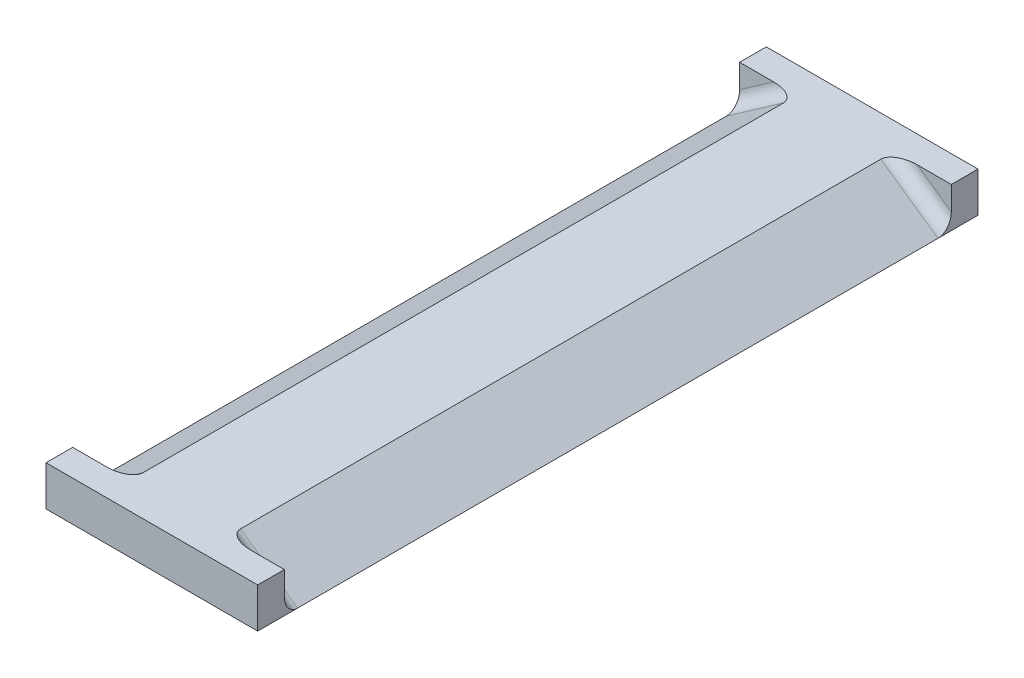
ISO-10303-21;
HEADER;
FILE_DESCRIPTION(('STEP AP214'),'2;1');
FILE_NAME('part.step','',(''),(''),'','','');
FILE_SCHEMA(('AUTOMOTIVE_DESIGN { 1 0 10303 214 1 1 1 1 }'));
ENDSEC;
DATA;
#1=APPLICATION_CONTEXT('core data for automotive mechanical design processes');
#2=APPLICATION_PROTOCOL_DEFINITION('international standard','automotive_design',2000,#1);
#3=PRODUCT_CONTEXT('',#1,'mechanical');
#4=PRODUCT('Part','Part','',(#3));
#5=PRODUCT_RELATED_PRODUCT_CATEGORY('part','',(#4));
#6=PRODUCT_DEFINITION_FORMATION('','',#4);
#7=PRODUCT_DEFINITION_CONTEXT('part definition',#1,'design');
#8=PRODUCT_DEFINITION('design','',#6,#7);
#9=PRODUCT_DEFINITION_SHAPE('','',#8);
#10=(LENGTH_UNIT() NAMED_UNIT(*) SI_UNIT(.MILLI.,.METRE.));
#11=(NAMED_UNIT(*) PLANE_ANGLE_UNIT() SI_UNIT($,.RADIAN.));
#12=(NAMED_UNIT(*) SI_UNIT($,.STERADIAN.) SOLID_ANGLE_UNIT());
#13=UNCERTAINTY_MEASURE_WITH_UNIT(LENGTH_MEASURE(1.E-05),#10,'distance_accuracy_value','');
#14=(GEOMETRIC_REPRESENTATION_CONTEXT(3) GLOBAL_UNCERTAINTY_ASSIGNED_CONTEXT((#13)) GLOBAL_UNIT_ASSIGNED_CONTEXT((#10,
#11,#12)) REPRESENTATION_CONTEXT('',''));
#15=CARTESIAN_POINT('',(0.,0.,0.));
#16=DIRECTION('',(0.,0.,1.));
#17=DIRECTION('',(1.,0.,0.));
#18=AXIS2_PLACEMENT_3D('',#15,#16,#17);
#19=CARTESIAN_POINT('',(3.65,0.,25.));
#20=DIRECTION('',(0.,-1.,0.));
#21=DIRECTION('',(0.,0.,-1.));
#22=AXIS2_PLACEMENT_3D('',#19,#20,#21);
#23=PLANE('',#22);
#24=DIRECTION('',(-1.,0.,0.));
#25=VECTOR('',#24,1.);
#26=CARTESIAN_POINT('',(-2.1422220101132,0.,25.));
#27=LINE('',#26,#25);
#28=CARTESIAN_POINT('',(5.7922220101132,0.,25.));
#29=VERTEX_POINT('',#28);
#30=CARTESIAN_POINT('',(4.52172339781056,0.,25.));
#31=VERTEX_POINT('',#30);
#32=EDGE_CURVE('E178',#29,#31,#27,.T.);
#33=ORIENTED_EDGE('',*,*,#32,.T.);
#34=CARTESIAN_POINT('',(4.52172339781056,0.,24.5));
#35=DIRECTION('',(0.,-1.,0.));
#36=DIRECTION('',(-1.,0.,0.));
#37=AXIS2_PLACEMENT_3D('',#34,#35,#36);
#38=ELLIPSE('',#37,0.871723397810556,0.5);
#39=CARTESIAN_POINT('',(3.65,0.,24.5));
#40=VERTEX_POINT('',#39);
#41=EDGE_CURVE('E257',#31,#40,#38,.T.);
#42=ORIENTED_EDGE('',*,*,#41,.T.);
#43=DIRECTION('',(0.,0.,-1.));
#44=VECTOR('',#43,1.);
#45=CARTESIAN_POINT('',(3.65,0.,25.));
#46=LINE('',#45,#44);
#47=CARTESIAN_POINT('',(3.65,0.,0.5));
#48=VERTEX_POINT('',#47);
#49=EDGE_CURVE('E207',#40,#48,#46,.T.);
#50=ORIENTED_EDGE('',*,*,#49,.T.);
#51=CARTESIAN_POINT('',(4.52172339781056,0.,0.5));
#52=DIRECTION('',(0.,-1.,0.));
#53=DIRECTION('',(-1.,0.,0.));
#54=AXIS2_PLACEMENT_3D('',#51,#52,#53);
#55=ELLIPSE('',#54,0.871723397810556,0.5);
#56=CARTESIAN_POINT('',(4.52172339781056,0.,0.));
#57=VERTEX_POINT('',#56);
#58=EDGE_CURVE('E263',#48,#57,#55,.T.);
#59=ORIENTED_EDGE('',*,*,#58,.T.);
#60=DIRECTION('',(1.,0.,0.));
#61=VECTOR('',#60,1.);
#62=CARTESIAN_POINT('',(5.7922220101132,0.,0.));
#63=LINE('',#62,#61);
#64=CARTESIAN_POINT('',(5.7922220101132,0.,0.));
#65=VERTEX_POINT('',#64);
#66=EDGE_CURVE('E283',#57,#65,#63,.T.);
#67=ORIENTED_EDGE('',*,*,#66,.T.);
#68=DIRECTION('',(0.,0.,1.));
#69=VECTOR('',#68,1.);
#70=CARTESIAN_POINT('',(5.7922220101132,0.,-1.));
#71=LINE('',#70,#69);
#72=CARTESIAN_POINT('',(5.7922220101132,0.,-1.));
#73=VERTEX_POINT('',#72);
#74=EDGE_CURVE('E339',#73,#65,#71,.T.);
#75=ORIENTED_EDGE('',*,*,#74,.F.);
#76=DIRECTION('',(1.,0.,0.));
#77=VECTOR('',#76,1.);
#78=CARTESIAN_POINT('',(5.7922220101132,0.,-1.));
#79=LINE('',#78,#77);
#80=CARTESIAN_POINT('',(-2.1422220101132,0.,-1.));
#81=VERTEX_POINT('',#80);
#82=EDGE_CURVE('E148',#81,#73,#79,.T.);
#83=ORIENTED_EDGE('',*,*,#82,.F.);
#84=DIRECTION('',(0.,0.,1.));
#85=VECTOR('',#84,1.);
#86=CARTESIAN_POINT('',(-2.1422220101132,0.,-1.));
#87=LINE('',#86,#85);
#88=CARTESIAN_POINT('',(-2.1422220101132,0.,0.));
#89=VERTEX_POINT('',#88);
#90=EDGE_CURVE('E169',#81,#89,#87,.T.);
#91=ORIENTED_EDGE('',*,*,#90,.T.);
#92=CARTESIAN_POINT('',(-0.871723397810556,0.,0.));
#93=VERTEX_POINT('',#92);
#94=EDGE_CURVE('E153',#89,#93,#63,.T.);
#95=ORIENTED_EDGE('',*,*,#94,.T.);
#96=CARTESIAN_POINT('',(-0.871723397810556,0.,0.5));
#97=DIRECTION('',(0.,-1.,0.));
#98=DIRECTION('',(-1.,0.,0.));
#99=AXIS2_PLACEMENT_3D('',#96,#97,#98);
#100=ELLIPSE('',#99,0.871723397810556,0.5);
#101=CARTESIAN_POINT('',(0.,0.,0.5));
#102=VERTEX_POINT('',#101);
#103=EDGE_CURVE('E11',#93,#102,#100,.T.);
#104=ORIENTED_EDGE('',*,*,#103,.T.);
#105=DIRECTION('',(0.,0.,-1.));
#106=VECTOR('',#105,1.);
#107=CARTESIAN_POINT('',(0.,0.,25.));
#108=LINE('',#107,#106);
#109=CARTESIAN_POINT('',(0.,0.,24.5));
#110=VERTEX_POINT('',#109);
#111=EDGE_CURVE('E217',#110,#102,#108,.T.);
#112=ORIENTED_EDGE('',*,*,#111,.F.);
#113=CARTESIAN_POINT('',(-0.871723397810556,0.,24.5));
#114=DIRECTION('',(0.,-1.,0.));
#115=DIRECTION('',(-1.,0.,0.));
#116=AXIS2_PLACEMENT_3D('',#113,#114,#115);
#117=ELLIPSE('',#116,0.871723397810556,0.5);
#118=CARTESIAN_POINT('',(-0.871723397810556,0.,25.));
#119=VERTEX_POINT('',#118);
#120=EDGE_CURVE('E254',#110,#119,#117,.T.);
#121=ORIENTED_EDGE('',*,*,#120,.T.);
#122=CARTESIAN_POINT('',(-2.1422220101132,0.,25.));
#123=VERTEX_POINT('',#122);
#124=EDGE_CURVE('E190',#119,#123,#27,.T.);
#125=ORIENTED_EDGE('',*,*,#124,.T.);
#126=DIRECTION('',(0.,0.,-1.));
#127=VECTOR('',#126,1.);
#128=CARTESIAN_POINT('',(-2.1422220101132,0.,26.));
#129=LINE('',#128,#127);
#130=CARTESIAN_POINT('',(-2.1422220101132,0.,26.));
#131=VERTEX_POINT('',#130);
#132=EDGE_CURVE('E186',#131,#123,#129,.T.);
#133=ORIENTED_EDGE('',*,*,#132,.F.);
#134=DIRECTION('',(-1.,0.,0.));
#135=VECTOR('',#134,1.);
#136=CARTESIAN_POINT('',(-2.1422220101132,0.,26.));
#137=LINE('',#136,#135);
#138=CARTESIAN_POINT('',(5.7922220101132,0.,26.));
#139=VERTEX_POINT('',#138);
#140=EDGE_CURVE('E184',#139,#131,#137,.T.);
#141=ORIENTED_EDGE('',*,*,#140,.F.);
#142=DIRECTION('',(0.,0.,-1.));
#143=VECTOR('',#142,1.);
#144=CARTESIAN_POINT('',(5.7922220101132,0.,26.));
#145=LINE('',#144,#143);
#146=EDGE_CURVE('E197',#139,#29,#145,.T.);
#147=ORIENTED_EDGE('',*,*,#146,.T.);
#148=EDGE_LOOP('',(#33,#42,#50,#59,#67,#75,#83,#91,#95,#104,#112,#121,#125,#133,#141,#147));
#149=FACE_BOUND('',#148,.T.);
#150=ADVANCED_FACE('F38',(#149),#23,.F.);
#151=CARTESIAN_POINT('',(0.,0.,25.));
#152=DIRECTION('',(0.573576436351042,-0.819152044288995,0.));
#153=DIRECTION('',(0.819152044288995,0.573576436351042,0.));
#154=AXIS2_PLACEMENT_3D('',#151,#152,#153);
#155=PLANE('',#154);
#156=DIRECTION('',(0.,0.,-1.));
#157=VECTOR('',#156,1.);
#158=CARTESIAN_POINT('',(-2.1422220101132,-1.5,25.));
#159=LINE('',#158,#157);
#160=CARTESIAN_POINT('',(-2.1422220101132,-1.5,24.5));
#161=VERTEX_POINT('',#160);
#162=CARTESIAN_POINT('',(-2.1422220101132,-1.5,0.5));
#163=VERTEX_POINT('',#162);
#164=EDGE_CURVE('E214',#161,#163,#159,.T.);
#165=ORIENTED_EDGE('',*,*,#164,.F.);
#166=DIRECTION('',(-0.819152044288995,-0.573576436351042,0.));
#167=VECTOR('',#166,1.);
#168=CARTESIAN_POINT('',(0.,0.,24.5));
#169=LINE('',#168,#167);
#170=EDGE_CURVE('E229',#161,#110,#169,.F.);
#171=ORIENTED_EDGE('',*,*,#170,.T.);
#172=ORIENTED_EDGE('',*,*,#111,.T.);
#173=DIRECTION('',(-0.819152044288995,-0.573576436351042,0.));
#174=VECTOR('',#173,1.);
#175=CARTESIAN_POINT('',(0.,0.,0.5));
#176=LINE('',#175,#174);
#177=EDGE_CURVE('E225',#102,#163,#176,.T.);
#178=ORIENTED_EDGE('',*,*,#177,.T.);
#179=EDGE_LOOP('',(#165,#171,#172,#178));
#180=FACE_BOUND('',#179,.T.);
#181=ADVANCED_FACE('F292',(#180),#155,.F.);
#182=CARTESIAN_POINT('',(-2.1422220101132,-1.5,25.));
#183=DIRECTION('',(0.,1.,0.));
#184=DIRECTION('',(0.,0.,1.));
#185=AXIS2_PLACEMENT_3D('',#182,#183,#184);
#186=PLANE('',#185);
#187=DIRECTION('',(0.,0.,-1.));
#188=VECTOR('',#187,1.);
#189=CARTESIAN_POINT('',(-2.1422220101132,-1.5,26.));
#190=LINE('',#189,#188);
#191=CARTESIAN_POINT('',(-2.1422220101132,-1.5,26.));
#192=VERTEX_POINT('',#191);
#193=EDGE_CURVE('E204',#192,#161,#190,.T.);
#194=ORIENTED_EDGE('',*,*,#193,.T.);
#195=ORIENTED_EDGE('',*,*,#164,.T.);
#196=DIRECTION('',(0.,0.,1.));
#197=VECTOR('',#196,1.);
#198=CARTESIAN_POINT('',(-2.1422220101132,-1.5,-1.));
#199=LINE('',#198,#197);
#200=CARTESIAN_POINT('',(-2.1422220101132,-1.5,-1.));
#201=VERTEX_POINT('',#200);
#202=EDGE_CURVE('E138',#201,#163,#199,.T.);
#203=ORIENTED_EDGE('',*,*,#202,.F.);
#204=DIRECTION('',(-1.,0.,0.));
#205=VECTOR('',#204,1.);
#206=CARTESIAN_POINT('',(5.7922220101132,-1.5,-1.));
#207=LINE('',#206,#205);
#208=CARTESIAN_POINT('',(5.7922220101132,-1.5,-1.));
#209=VERTEX_POINT('',#208);
#210=EDGE_CURVE('E133',#209,#201,#207,.T.);
#211=ORIENTED_EDGE('',*,*,#210,.F.);
#212=DIRECTION('',(0.,0.,1.));
#213=VECTOR('',#212,1.);
#214=CARTESIAN_POINT('',(5.7922220101132,-1.5,-1.));
#215=LINE('',#214,#213);
#216=CARTESIAN_POINT('',(5.7922220101132,-1.5,0.5));
#217=VERTEX_POINT('',#216);
#218=EDGE_CURVE('E55',#209,#217,#215,.T.);
#219=ORIENTED_EDGE('',*,*,#218,.T.);
#220=DIRECTION('',(0.,0.,-1.));
#221=VECTOR('',#220,1.);
#222=CARTESIAN_POINT('',(5.7922220101132,-1.5,25.));
#223=LINE('',#222,#221);
#224=CARTESIAN_POINT('',(5.7922220101132,-1.5,24.5));
#225=VERTEX_POINT('',#224);
#226=EDGE_CURVE('E211',#225,#217,#223,.T.);
#227=ORIENTED_EDGE('',*,*,#226,.F.);
#228=DIRECTION('',(0.,0.,-1.));
#229=VECTOR('',#228,1.);
#230=CARTESIAN_POINT('',(5.7922220101132,-1.5,26.));
#231=LINE('',#230,#229);
#232=CARTESIAN_POINT('',(5.7922220101132,-1.5,26.));
#233=VERTEX_POINT('',#232);
#234=EDGE_CURVE('E201',#233,#225,#231,.T.);
#235=ORIENTED_EDGE('',*,*,#234,.F.);
#236=DIRECTION('',(1.,0.,0.));
#237=VECTOR('',#236,1.);
#238=CARTESIAN_POINT('',(-2.1422220101132,-1.5,26.));
#239=LINE('',#238,#237);
#240=EDGE_CURVE('E177',#192,#233,#239,.T.);
#241=ORIENTED_EDGE('',*,*,#240,.F.);
#242=EDGE_LOOP('',(#194,#195,#203,#211,#219,#227,#235,#241));
#243=FACE_BOUND('',#242,.T.);
#244=ADVANCED_FACE('F135',(#243),#186,.F.);
#245=CARTESIAN_POINT('',(5.7922220101132,-1.5,25.));
#246=DIRECTION('',(-0.573576436351042,-0.819152044288995,0.));
#247=DIRECTION('',(0.819152044288995,-0.573576436351042,0.));
#248=AXIS2_PLACEMENT_3D('',#245,#246,#247);
#249=PLANE('',#248);
#250=ORIENTED_EDGE('',*,*,#49,.F.);
#251=DIRECTION('',(-0.819152044288995,0.573576436351042,0.));
#252=VECTOR('',#251,1.);
#253=CARTESIAN_POINT('',(5.7922220101132,-1.5,24.5));
#254=LINE('',#253,#252);
#255=EDGE_CURVE('E240',#40,#225,#254,.F.);
#256=ORIENTED_EDGE('',*,*,#255,.T.);
#257=ORIENTED_EDGE('',*,*,#226,.T.);
#258=DIRECTION('',(-0.819152044288995,0.573576436351042,0.));
#259=VECTOR('',#258,1.);
#260=CARTESIAN_POINT('',(5.7922220101132,-1.5,0.5));
#261=LINE('',#260,#259);
#262=EDGE_CURVE('E236',#217,#48,#261,.T.);
#263=ORIENTED_EDGE('',*,*,#262,.T.);
#264=EDGE_LOOP('',(#250,#256,#257,#263));
#265=FACE_BOUND('',#264,.T.);
#266=ADVANCED_FACE('F326',(#265),#249,.F.);
#267=CARTESIAN_POINT('',(0.,0.,25.));
#268=DIRECTION('',(0.,0.,-1.));
#269=DIRECTION('',(-1.,0.,0.));
#270=AXIS2_PLACEMENT_3D('',#267,#268,#269);
#271=PLANE('',#270);
#272=ORIENTED_EDGE('',*,*,#124,.F.);
#273=DIRECTION('',(-0.819152044288995,-0.573576436351042,0.));
#274=VECTOR('',#273,1.);
#275=CARTESIAN_POINT('',(-0.286788218175521,0.409576022144497,25.));
#276=LINE('',#275,#274);
#277=CARTESIAN_POINT('',(-2.1422220101132,-0.889612705619275,25.));
#278=VERTEX_POINT('',#277);
#279=EDGE_CURVE('E221',#119,#278,#276,.T.);
#280=ORIENTED_EDGE('',*,*,#279,.T.);
#281=DIRECTION('',(0.,-1.,0.));
#282=VECTOR('',#281,1.);
#283=CARTESIAN_POINT('',(-2.1422220101132,-1.5,25.));
#284=LINE('',#283,#282);
#285=EDGE_CURVE('E162',#123,#278,#284,.T.);
#286=ORIENTED_EDGE('',*,*,#285,.F.);
#287=EDGE_LOOP('',(#272,#280,#286));
#288=FACE_BOUND('',#287,.T.);
#289=ADVANCED_FACE('F301',(#288),#271,.T.);
#290=CARTESIAN_POINT('',(-2.1422220101132,-1.5,26.));
#291=DIRECTION('',(1.,0.,0.));
#292=DIRECTION('',(0.,0.,-1.));
#293=AXIS2_PLACEMENT_3D('',#290,#291,#292);
#294=PLANE('',#293);
#295=ORIENTED_EDGE('',*,*,#285,.T.);
#296=CARTESIAN_POINT('',(-2.1422220101132,-0.889612705619275,24.5));
#297=DIRECTION('',(1.,0.,0.));
#298=DIRECTION('',(0.,-1.,0.));
#299=AXIS2_PLACEMENT_3D('',#296,#297,#298);
#300=ELLIPSE('',#299,0.610387294380726,0.5);
#301=EDGE_CURVE('E250',#278,#161,#300,.T.);
#302=ORIENTED_EDGE('',*,*,#301,.T.);
#303=ORIENTED_EDGE('',*,*,#193,.F.);
#304=DIRECTION('',(0.,-1.,0.));
#305=VECTOR('',#304,1.);
#306=CARTESIAN_POINT('',(-2.1422220101132,-1.5,26.));
#307=LINE('',#306,#305);
#308=EDGE_CURVE('E173',#131,#192,#307,.T.);
#309=ORIENTED_EDGE('',*,*,#308,.F.);
#310=ORIENTED_EDGE('',*,*,#132,.T.);
#311=EDGE_LOOP('',(#295,#302,#303,#309,#310));
#312=FACE_BOUND('',#311,.T.);
#313=ADVANCED_FACE('F304',(#312),#294,.F.);
#314=CARTESIAN_POINT('',(5.7922220101132,-1.5,26.));
#315=DIRECTION('',(-1.,0.,0.));
#316=DIRECTION('',(0.,-1.,0.));
#317=AXIS2_PLACEMENT_3D('',#314,#315,#316);
#318=PLANE('',#317);
#319=ORIENTED_EDGE('',*,*,#234,.T.);
#320=CARTESIAN_POINT('',(5.7922220101132,-0.889612705619275,24.5));
#321=DIRECTION('',(-1.,0.,0.));
#322=DIRECTION('',(0.,1.,0.));
#323=AXIS2_PLACEMENT_3D('',#320,#321,#322);
#324=ELLIPSE('',#323,0.610387294380725,0.5);
#325=CARTESIAN_POINT('',(5.7922220101132,-0.889612705619275,25.));
#326=VERTEX_POINT('',#325);
#327=EDGE_CURVE('E260',#225,#326,#324,.T.);
#328=ORIENTED_EDGE('',*,*,#327,.T.);
#329=DIRECTION('',(0.,1.,0.));
#330=VECTOR('',#329,1.);
#331=CARTESIAN_POINT('',(5.7922220101132,-1.5,25.));
#332=LINE('',#331,#330);
#333=EDGE_CURVE('E167',#326,#29,#332,.T.);
#334=ORIENTED_EDGE('',*,*,#333,.T.);
#335=ORIENTED_EDGE('',*,*,#146,.F.);
#336=DIRECTION('',(0.,1.,0.));
#337=VECTOR('',#336,1.);
#338=CARTESIAN_POINT('',(5.7922220101132,-1.5,26.));
#339=LINE('',#338,#337);
#340=EDGE_CURVE('E181',#233,#139,#339,.T.);
#341=ORIENTED_EDGE('',*,*,#340,.F.);
#342=EDGE_LOOP('',(#319,#328,#334,#335,#341));
#343=FACE_BOUND('',#342,.T.);
#344=ADVANCED_FACE('F315',(#343),#318,.F.);
#345=CARTESIAN_POINT('',(0.,0.,26.));
#346=DIRECTION('',(0.,0.,-1.));
#347=DIRECTION('',(-1.,0.,0.));
#348=AXIS2_PLACEMENT_3D('',#345,#346,#347);
#349=PLANE('',#348);
#350=ORIENTED_EDGE('',*,*,#308,.T.);
#351=ORIENTED_EDGE('',*,*,#240,.T.);
#352=ORIENTED_EDGE('',*,*,#340,.T.);
#353=ORIENTED_EDGE('',*,*,#140,.T.);
#354=EDGE_LOOP('',(#350,#351,#352,#353));
#355=FACE_BOUND('',#354,.T.);
#356=ADVANCED_FACE('F311',(#355),#349,.F.);
#357=ORIENTED_EDGE('',*,*,#333,.F.);
#358=DIRECTION('',(-0.819152044288995,0.573576436351042,0.));
#359=VECTOR('',#358,1.);
#360=CARTESIAN_POINT('',(1.48760145660616,2.12451505507877,25.));
#361=LINE('',#360,#359);
#362=EDGE_CURVE('E232',#326,#31,#361,.T.);
#363=ORIENTED_EDGE('',*,*,#362,.T.);
#364=ORIENTED_EDGE('',*,*,#32,.F.);
#365=EDGE_LOOP('',(#357,#363,#364));
#366=FACE_BOUND('',#365,.T.);
#367=ADVANCED_FACE('F320',(#366),#271,.T.);
#368=CARTESIAN_POINT('',(0.,0.,0.));
#369=DIRECTION('',(0.,0.,1.));
#370=DIRECTION('',(1.,0.,0.));
#371=AXIS2_PLACEMENT_3D('',#368,#369,#370);
#372=PLANE('',#371);
#373=ORIENTED_EDGE('',*,*,#66,.F.);
#374=DIRECTION('',(-0.819152044288995,0.573576436351042,0.));
#375=VECTOR('',#374,1.);
#376=CARTESIAN_POINT('',(1.48760145660616,2.12451505507877,0.));
#377=LINE('',#376,#375);
#378=CARTESIAN_POINT('',(5.7922220101132,-0.889612705619275,0.));
#379=VERTEX_POINT('',#378);
#380=EDGE_CURVE('E244',#57,#379,#377,.F.);
#381=ORIENTED_EDGE('',*,*,#380,.T.);
#382=DIRECTION('',(0.,-1.,0.));
#383=VECTOR('',#382,1.);
#384=CARTESIAN_POINT('',(5.7922220101132,-1.5,0.));
#385=LINE('',#384,#383);
#386=EDGE_CURVE('E284',#65,#379,#385,.T.);
#387=ORIENTED_EDGE('',*,*,#386,.F.);
#388=EDGE_LOOP('',(#373,#381,#387));
#389=FACE_BOUND('',#388,.T.);
#390=ADVANCED_FACE('F333',(#389),#372,.T.);
#391=DIRECTION('',(0.,1.,0.));
#392=VECTOR('',#391,1.);
#393=CARTESIAN_POINT('',(-2.1422220101132,-1.5,0.));
#394=LINE('',#393,#392);
#395=CARTESIAN_POINT('',(-2.1422220101132,-0.889612705619275,0.));
#396=VERTEX_POINT('',#395);
#397=EDGE_CURVE('E273',#396,#89,#394,.T.);
#398=ORIENTED_EDGE('',*,*,#397,.F.);
#399=DIRECTION('',(-0.819152044288995,-0.573576436351042,0.));
#400=VECTOR('',#399,1.);
#401=CARTESIAN_POINT('',(-0.286788218175521,0.409576022144498,0.));
#402=LINE('',#401,#400);
#403=EDGE_CURVE('E247',#396,#93,#402,.F.);
#404=ORIENTED_EDGE('',*,*,#403,.T.);
#405=ORIENTED_EDGE('',*,*,#94,.F.);
#406=EDGE_LOOP('',(#398,#404,#405));
#407=FACE_BOUND('',#406,.T.);
#408=ADVANCED_FACE('F280',(#407),#372,.T.);
#409=CARTESIAN_POINT('',(5.7922220101132,-1.5,-1.));
#410=DIRECTION('',(-1.,0.,0.));
#411=DIRECTION('',(0.,0.,1.));
#412=AXIS2_PLACEMENT_3D('',#409,#410,#411);
#413=PLANE('',#412);
#414=ORIENTED_EDGE('',*,*,#386,.T.);
#415=CARTESIAN_POINT('',(5.7922220101132,-0.889612705619275,0.5));
#416=DIRECTION('',(-1.,0.,0.));
#417=DIRECTION('',(0.,1.,0.));
#418=AXIS2_PLACEMENT_3D('',#415,#416,#417);
#419=ELLIPSE('',#418,0.610387294380726,0.5);
#420=EDGE_CURVE('E159',#379,#217,#419,.T.);
#421=ORIENTED_EDGE('',*,*,#420,.T.);
#422=ORIENTED_EDGE('',*,*,#218,.F.);
#423=DIRECTION('',(0.,-1.,0.));
#424=VECTOR('',#423,1.);
#425=CARTESIAN_POINT('',(5.7922220101132,-1.5,-1.));
#426=LINE('',#425,#424);
#427=EDGE_CURVE('E143',#73,#209,#426,.T.);
#428=ORIENTED_EDGE('',*,*,#427,.F.);
#429=ORIENTED_EDGE('',*,*,#74,.T.);
#430=EDGE_LOOP('',(#414,#421,#422,#428,#429));
#431=FACE_BOUND('',#430,.T.);
#432=ADVANCED_FACE('F157',(#431),#413,.F.);
#433=CARTESIAN_POINT('',(-2.1422220101132,-1.5,-1.));
#434=DIRECTION('',(1.,0.,0.));
#435=DIRECTION('',(0.,0.,-1.));
#436=AXIS2_PLACEMENT_3D('',#433,#434,#435);
#437=PLANE('',#436);
#438=ORIENTED_EDGE('',*,*,#202,.T.);
#439=CARTESIAN_POINT('',(-2.1422220101132,-0.889612705619275,0.5));
#440=DIRECTION('',(1.,0.,0.));
#441=DIRECTION('',(0.,-1.,0.));
#442=AXIS2_PLACEMENT_3D('',#439,#440,#441);
#443=ELLIPSE('',#442,0.610387294380726,0.5);
#444=EDGE_CURVE('E48',#163,#396,#443,.T.);
#445=ORIENTED_EDGE('',*,*,#444,.T.);
#446=ORIENTED_EDGE('',*,*,#397,.T.);
#447=ORIENTED_EDGE('',*,*,#90,.F.);
#448=DIRECTION('',(0.,1.,0.));
#449=VECTOR('',#448,1.);
#450=CARTESIAN_POINT('',(-2.1422220101132,-1.5,-1.));
#451=LINE('',#450,#449);
#452=EDGE_CURVE('E142',#201,#81,#451,.T.);
#453=ORIENTED_EDGE('',*,*,#452,.F.);
#454=EDGE_LOOP('',(#438,#445,#446,#447,#453));
#455=FACE_BOUND('',#454,.T.);
#456=ADVANCED_FACE('F271',(#455),#437,.F.);
#457=CARTESIAN_POINT('',(0.,0.,-1.));
#458=DIRECTION('',(0.,0.,1.));
#459=DIRECTION('',(1.,0.,0.));
#460=AXIS2_PLACEMENT_3D('',#457,#458,#459);
#461=PLANE('',#460);
#462=ORIENTED_EDGE('',*,*,#427,.T.);
#463=ORIENTED_EDGE('',*,*,#210,.T.);
#464=ORIENTED_EDGE('',*,*,#452,.T.);
#465=ORIENTED_EDGE('',*,*,#82,.T.);
#466=EDGE_LOOP('',(#462,#463,#464,#465));
#467=FACE_BOUND('',#466,.T.);
#468=ADVANCED_FACE('F146',(#467),#461,.F.);
#469=CARTESIAN_POINT('',(-0.286788218175521,0.409576022144498,24.5));
#470=DIRECTION('',(-0.819152044288995,-0.573576436351042,0.));
#471=DIRECTION('',(0.573576436351042,-0.819152044288995,0.));
#472=AXIS2_PLACEMENT_3D('',#469,#470,#471);
#473=CYLINDRICAL_SURFACE('',#472,0.5);
#474=ORIENTED_EDGE('',*,*,#120,.F.);
#475=ORIENTED_EDGE('',*,*,#170,.F.);
#476=ORIENTED_EDGE('',*,*,#301,.F.);
#477=ORIENTED_EDGE('',*,*,#279,.F.);
#478=EDGE_LOOP('',(#474,#475,#476,#477));
#479=FACE_BOUND('',#478,.T.);
#480=ADVANCED_FACE('F295',(#479),#473,.F.);
#481=CARTESIAN_POINT('',(1.48760145660616,2.12451505507877,24.5));
#482=DIRECTION('',(-0.819152044288995,0.573576436351042,0.));
#483=DIRECTION('',(-0.573576436351042,-0.819152044288995,0.));
#484=AXIS2_PLACEMENT_3D('',#481,#482,#483);
#485=CYLINDRICAL_SURFACE('',#484,0.5);
#486=ORIENTED_EDGE('',*,*,#327,.F.);
#487=ORIENTED_EDGE('',*,*,#255,.F.);
#488=ORIENTED_EDGE('',*,*,#41,.F.);
#489=ORIENTED_EDGE('',*,*,#362,.F.);
#490=EDGE_LOOP('',(#486,#487,#488,#489));
#491=FACE_BOUND('',#490,.T.);
#492=ADVANCED_FACE('F322',(#491),#485,.F.);
#493=CARTESIAN_POINT('',(6.07901022828872,-1.0904239778555,0.5));
#494=DIRECTION('',(-0.819152044288995,0.573576436351042,0.));
#495=DIRECTION('',(-0.573576436351042,-0.819152044288995,0.));
#496=AXIS2_PLACEMENT_3D('',#493,#494,#495);
#497=CYLINDRICAL_SURFACE('',#496,0.5);
#498=ORIENTED_EDGE('',*,*,#420,.F.);
#499=ORIENTED_EDGE('',*,*,#380,.F.);
#500=ORIENTED_EDGE('',*,*,#58,.F.);
#501=ORIENTED_EDGE('',*,*,#262,.F.);
#502=EDGE_LOOP('',(#498,#499,#500,#501));
#503=FACE_BOUND('',#502,.T.);
#504=ADVANCED_FACE('F328',(#503),#497,.F.);
#505=CARTESIAN_POINT('',(-0.286788218175521,0.409576022144498,0.5));
#506=DIRECTION('',(-0.819152044288995,-0.573576436351042,0.));
#507=DIRECTION('',(0.573576436351042,-0.819152044288995,0.));
#508=AXIS2_PLACEMENT_3D('',#505,#506,#507);
#509=CYLINDRICAL_SURFACE('',#508,0.5);
#510=ORIENTED_EDGE('',*,*,#103,.F.);
#511=ORIENTED_EDGE('',*,*,#403,.F.);
#512=ORIENTED_EDGE('',*,*,#444,.F.);
#513=ORIENTED_EDGE('',*,*,#177,.F.);
#514=EDGE_LOOP('',(#510,#511,#512,#513));
#515=FACE_BOUND('',#514,.T.);
#516=ADVANCED_FACE('F40',(#515),#509,.F.);
#517=CLOSED_SHELL('',(#150,#181,#244,#266,#289,#313,#344,#356,#367,#390,#408,#432,#456,#468,
#480,#492,#504,#516));
#518=MANIFOLD_SOLID_BREP('B2',#517);
#519=ADVANCED_BREP_SHAPE_REPRESENTATION('',(#18,#518),#14);
#520=SHAPE_DEFINITION_REPRESENTATION(#9,#519);
ENDSEC;
END-ISO-10303-21;
